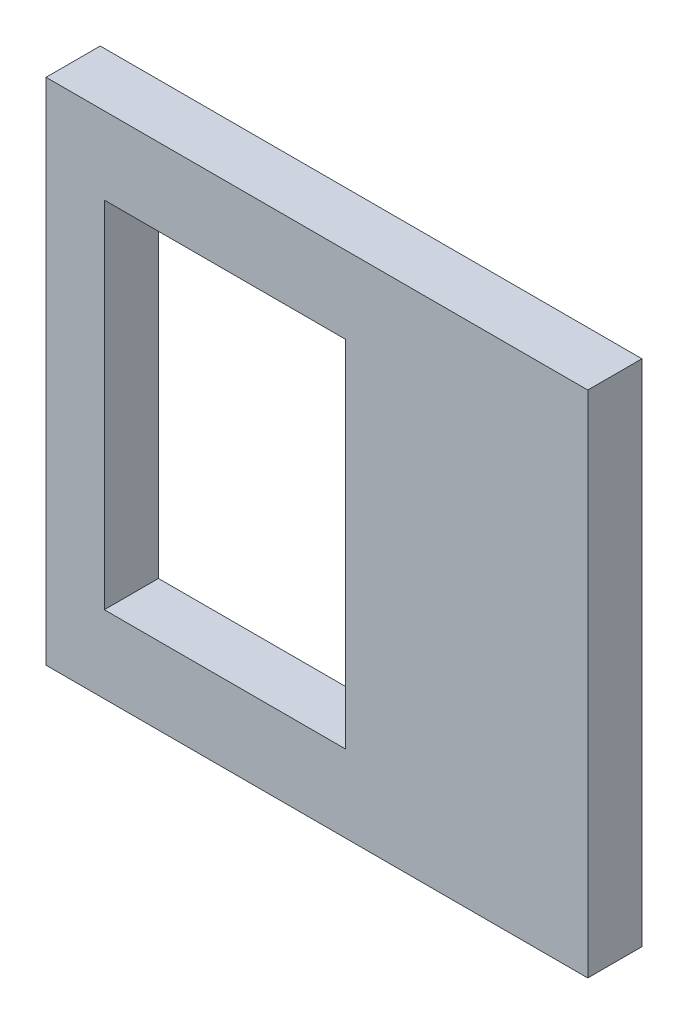
ISO-10303-21;
HEADER;
FILE_DESCRIPTION(('STEP AP214'),'2;1');
FILE_NAME('part.step','',(''),(''),'','','');
FILE_SCHEMA(('AUTOMOTIVE_DESIGN { 1 0 10303 214 1 1 1 1 }'));
ENDSEC;
DATA;
#1=APPLICATION_CONTEXT('core data for automotive mechanical design processes');
#2=APPLICATION_PROTOCOL_DEFINITION('international standard','automotive_design',2000,#1);
#3=PRODUCT_CONTEXT('',#1,'mechanical');
#4=PRODUCT('Part','Part','',(#3));
#5=PRODUCT_RELATED_PRODUCT_CATEGORY('part','',(#4));
#6=PRODUCT_DEFINITION_FORMATION('','',#4);
#7=PRODUCT_DEFINITION_CONTEXT('part definition',#1,'design');
#8=PRODUCT_DEFINITION('design','',#6,#7);
#9=PRODUCT_DEFINITION_SHAPE('','',#8);
#10=(LENGTH_UNIT() NAMED_UNIT(*) SI_UNIT(.MILLI.,.METRE.));
#11=(NAMED_UNIT(*) PLANE_ANGLE_UNIT() SI_UNIT($,.RADIAN.));
#12=(NAMED_UNIT(*) SI_UNIT($,.STERADIAN.) SOLID_ANGLE_UNIT());
#13=UNCERTAINTY_MEASURE_WITH_UNIT(LENGTH_MEASURE(1.E-05),#10,'distance_accuracy_value','');
#14=(GEOMETRIC_REPRESENTATION_CONTEXT(3) GLOBAL_UNCERTAINTY_ASSIGNED_CONTEXT((#13)) GLOBAL_UNIT_ASSIGNED_CONTEXT((#10,
#11,#12)) REPRESENTATION_CONTEXT('',''));
#15=CARTESIAN_POINT('',(0.,0.,0.));
#16=DIRECTION('',(0.,0.,1.));
#17=DIRECTION('',(1.,0.,0.));
#18=AXIS2_PLACEMENT_3D('',#15,#16,#17);
#19=CARTESIAN_POINT('',(50.,-47.,10.));
#20=DIRECTION('',(-1.,0.,0.));
#21=DIRECTION('',(0.,0.,1.));
#22=AXIS2_PLACEMENT_3D('',#19,#20,#21);
#23=PLANE('',#22);
#24=DIRECTION('',(0.,1.,0.));
#25=VECTOR('',#24,1.);
#26=CARTESIAN_POINT('',(50.,-47.,0.));
#27=LINE('',#26,#25);
#28=CARTESIAN_POINT('',(50.,-47.,0.));
#29=VERTEX_POINT('',#28);
#30=CARTESIAN_POINT('',(50.,47.,0.));
#31=VERTEX_POINT('',#30);
#32=EDGE_CURVE('E153',#29,#31,#27,.T.);
#33=ORIENTED_EDGE('',*,*,#32,.T.);
#34=DIRECTION('',(0.,0.,-1.));
#35=VECTOR('',#34,1.);
#36=CARTESIAN_POINT('',(50.,47.,10.));
#37=LINE('',#36,#35);
#38=CARTESIAN_POINT('',(50.,47.,10.));
#39=VERTEX_POINT('',#38);
#40=EDGE_CURVE('E11',#39,#31,#37,.T.);
#41=ORIENTED_EDGE('',*,*,#40,.F.);
#42=DIRECTION('',(0.,1.,0.));
#43=VECTOR('',#42,1.);
#44=CARTESIAN_POINT('',(50.,-47.,10.));
#45=LINE('',#44,#43);
#46=CARTESIAN_POINT('',(50.,-47.,10.));
#47=VERTEX_POINT('',#46);
#48=EDGE_CURVE('E159',#47,#39,#45,.T.);
#49=ORIENTED_EDGE('',*,*,#48,.F.);
#50=DIRECTION('',(0.,0.,-1.));
#51=VECTOR('',#50,1.);
#52=CARTESIAN_POINT('',(50.,-47.,10.));
#53=LINE('',#52,#51);
#54=EDGE_CURVE('E173',#47,#29,#53,.T.);
#55=ORIENTED_EDGE('',*,*,#54,.T.);
#56=EDGE_LOOP('',(#33,#41,#49,#55));
#57=FACE_BOUND('',#56,.T.);
#58=ADVANCED_FACE('F45',(#57),#23,.F.);
#59=CARTESIAN_POINT('',(-50.,47.,10.));
#60=DIRECTION('',(0.,-1.,0.));
#61=DIRECTION('',(0.,0.,-1.));
#62=AXIS2_PLACEMENT_3D('',#59,#60,#61);
#63=PLANE('',#62);
#64=DIRECTION('',(-1.,0.,0.));
#65=VECTOR('',#64,1.);
#66=CARTESIAN_POINT('',(-50.,47.,0.));
#67=LINE('',#66,#65);
#68=CARTESIAN_POINT('',(-50.,47.,0.));
#69=VERTEX_POINT('',#68);
#70=EDGE_CURVE('E177',#31,#69,#67,.T.);
#71=ORIENTED_EDGE('',*,*,#70,.T.);
#72=DIRECTION('',(0.,0.,-1.));
#73=VECTOR('',#72,1.);
#74=CARTESIAN_POINT('',(-50.,47.,10.));
#75=LINE('',#74,#73);
#76=CARTESIAN_POINT('',(-50.,47.,10.));
#77=VERTEX_POINT('',#76);
#78=EDGE_CURVE('E53',#77,#69,#75,.T.);
#79=ORIENTED_EDGE('',*,*,#78,.F.);
#80=DIRECTION('',(-1.,0.,0.));
#81=VECTOR('',#80,1.);
#82=CARTESIAN_POINT('',(-50.,47.,10.));
#83=LINE('',#82,#81);
#84=EDGE_CURVE('E163',#39,#77,#83,.T.);
#85=ORIENTED_EDGE('',*,*,#84,.F.);
#86=ORIENTED_EDGE('',*,*,#40,.T.);
#87=EDGE_LOOP('',(#71,#79,#85,#86));
#88=FACE_BOUND('',#87,.T.);
#89=ADVANCED_FACE('F211',(#88),#63,.F.);
#90=CARTESIAN_POINT('',(-50.,-47.,10.));
#91=DIRECTION('',(1.,0.,0.));
#92=DIRECTION('',(0.,0.,-1.));
#93=AXIS2_PLACEMENT_3D('',#90,#91,#92);
#94=PLANE('',#93);
#95=DIRECTION('',(0.,-1.,0.));
#96=VECTOR('',#95,1.);
#97=CARTESIAN_POINT('',(-50.,-47.,0.));
#98=LINE('',#97,#96);
#99=CARTESIAN_POINT('',(-50.,-47.,0.));
#100=VERTEX_POINT('',#99);
#101=EDGE_CURVE('E180',#69,#100,#98,.T.);
#102=ORIENTED_EDGE('',*,*,#101,.T.);
#103=DIRECTION('',(0.,0.,-1.));
#104=VECTOR('',#103,1.);
#105=CARTESIAN_POINT('',(-50.,-47.,10.));
#106=LINE('',#105,#104);
#107=CARTESIAN_POINT('',(-50.,-47.,10.));
#108=VERTEX_POINT('',#107);
#109=EDGE_CURVE('E188',#108,#100,#106,.T.);
#110=ORIENTED_EDGE('',*,*,#109,.F.);
#111=DIRECTION('',(0.,-1.,0.));
#112=VECTOR('',#111,1.);
#113=CARTESIAN_POINT('',(-50.,-47.,10.));
#114=LINE('',#113,#112);
#115=EDGE_CURVE('E167',#77,#108,#114,.T.);
#116=ORIENTED_EDGE('',*,*,#115,.F.);
#117=ORIENTED_EDGE('',*,*,#78,.T.);
#118=EDGE_LOOP('',(#102,#110,#116,#117));
#119=FACE_BOUND('',#118,.T.);
#120=ADVANCED_FACE('F197',(#119),#94,.F.);
#121=CARTESIAN_POINT('',(-50.,-47.,10.));
#122=DIRECTION('',(0.,1.,0.));
#123=DIRECTION('',(0.,0.,1.));
#124=AXIS2_PLACEMENT_3D('',#121,#122,#123);
#125=PLANE('',#124);
#126=DIRECTION('',(1.,0.,0.));
#127=VECTOR('',#126,1.);
#128=CARTESIAN_POINT('',(-50.,-47.,0.));
#129=LINE('',#128,#127);
#130=EDGE_CURVE('E164',#100,#29,#129,.T.);
#131=ORIENTED_EDGE('',*,*,#130,.T.);
#132=ORIENTED_EDGE('',*,*,#54,.F.);
#133=DIRECTION('',(1.,0.,0.));
#134=VECTOR('',#133,1.);
#135=CARTESIAN_POINT('',(-50.,-47.,10.));
#136=LINE('',#135,#134);
#137=EDGE_CURVE('E170',#108,#47,#136,.T.);
#138=ORIENTED_EDGE('',*,*,#137,.F.);
#139=ORIENTED_EDGE('',*,*,#109,.T.);
#140=EDGE_LOOP('',(#131,#132,#138,#139));
#141=FACE_BOUND('',#140,.T.);
#142=ADVANCED_FACE('F204',(#141),#125,.F.);
#143=CARTESIAN_POINT('',(0.,0.,10.));
#144=DIRECTION('',(0.,0.,-1.));
#145=DIRECTION('',(-1.,0.,0.));
#146=AXIS2_PLACEMENT_3D('',#143,#144,#145);
#147=PLANE('',#146);
#148=DIRECTION('',(1.,0.,0.));
#149=VECTOR('',#148,1.);
#150=CARTESIAN_POINT('',(5.25,-32.75,10.));
#151=LINE('',#150,#149);
#152=CARTESIAN_POINT('',(-39.25,-32.75,10.));
#153=VERTEX_POINT('',#152);
#154=CARTESIAN_POINT('',(5.25,-32.75,10.));
#155=VERTEX_POINT('',#154);
#156=EDGE_CURVE('E144',#153,#155,#151,.T.);
#157=ORIENTED_EDGE('',*,*,#156,.F.);
#158=DIRECTION('',(0.,-1.,0.));
#159=VECTOR('',#158,1.);
#160=CARTESIAN_POINT('',(-39.25,-32.75,10.));
#161=LINE('',#160,#159);
#162=CARTESIAN_POINT('',(-39.25,32.75,10.));
#163=VERTEX_POINT('',#162);
#164=EDGE_CURVE('E60',#163,#153,#161,.T.);
#165=ORIENTED_EDGE('',*,*,#164,.F.);
#166=DIRECTION('',(-1.,0.,0.));
#167=VECTOR('',#166,1.);
#168=CARTESIAN_POINT('',(5.25,32.75,10.));
#169=LINE('',#168,#167);
#170=CARTESIAN_POINT('',(5.25,32.75,10.));
#171=VERTEX_POINT('',#170);
#172=EDGE_CURVE('E131',#171,#163,#169,.T.);
#173=ORIENTED_EDGE('',*,*,#172,.F.);
#174=DIRECTION('',(0.,1.,0.));
#175=VECTOR('',#174,1.);
#176=CARTESIAN_POINT('',(5.25,-32.75,10.));
#177=LINE('',#176,#175);
#178=EDGE_CURVE('E135',#155,#171,#177,.T.);
#179=ORIENTED_EDGE('',*,*,#178,.F.);
#180=EDGE_LOOP('',(#157,#165,#173,#179));
#181=FACE_BOUND('',#180,.T.);
#182=ORIENTED_EDGE('',*,*,#48,.T.);
#183=ORIENTED_EDGE('',*,*,#84,.T.);
#184=ORIENTED_EDGE('',*,*,#115,.T.);
#185=ORIENTED_EDGE('',*,*,#137,.T.);
#186=EDGE_LOOP('',(#182,#183,#184,#185));
#187=FACE_BOUND('',#186,.T.);
#188=ADVANCED_FACE('F210',(#181,#187),#147,.F.);
#189=CARTESIAN_POINT('',(0.,0.,0.));
#190=DIRECTION('',(0.,0.,-1.));
#191=DIRECTION('',(-1.,0.,0.));
#192=AXIS2_PLACEMENT_3D('',#189,#190,#191);
#193=PLANE('',#192);
#194=DIRECTION('',(0.,-1.,0.));
#195=VECTOR('',#194,1.);
#196=CARTESIAN_POINT('',(-39.25,-32.75,0.));
#197=LINE('',#196,#195);
#198=CARTESIAN_POINT('',(-39.25,32.75,0.));
#199=VERTEX_POINT('',#198);
#200=CARTESIAN_POINT('',(-39.25,-32.75,0.));
#201=VERTEX_POINT('',#200);
#202=EDGE_CURVE('E112',#199,#201,#197,.T.);
#203=ORIENTED_EDGE('',*,*,#202,.T.);
#204=DIRECTION('',(1.,0.,0.));
#205=VECTOR('',#204,1.);
#206=CARTESIAN_POINT('',(5.25,-32.75,0.));
#207=LINE('',#206,#205);
#208=CARTESIAN_POINT('',(5.25,-32.75,0.));
#209=VERTEX_POINT('',#208);
#210=EDGE_CURVE('E122',#201,#209,#207,.T.);
#211=ORIENTED_EDGE('',*,*,#210,.T.);
#212=DIRECTION('',(0.,1.,0.));
#213=VECTOR('',#212,1.);
#214=CARTESIAN_POINT('',(5.25,-32.75,0.));
#215=LINE('',#214,#213);
#216=CARTESIAN_POINT('',(5.25,32.75,0.));
#217=VERTEX_POINT('',#216);
#218=EDGE_CURVE('E68',#209,#217,#215,.T.);
#219=ORIENTED_EDGE('',*,*,#218,.T.);
#220=DIRECTION('',(-1.,0.,0.));
#221=VECTOR('',#220,1.);
#222=CARTESIAN_POINT('',(5.25,32.75,0.));
#223=LINE('',#222,#221);
#224=EDGE_CURVE('E119',#217,#199,#223,.T.);
#225=ORIENTED_EDGE('',*,*,#224,.T.);
#226=EDGE_LOOP('',(#203,#211,#219,#225));
#227=FACE_BOUND('',#226,.T.);
#228=ORIENTED_EDGE('',*,*,#32,.F.);
#229=ORIENTED_EDGE('',*,*,#130,.F.);
#230=ORIENTED_EDGE('',*,*,#101,.F.);
#231=ORIENTED_EDGE('',*,*,#70,.F.);
#232=EDGE_LOOP('',(#228,#229,#230,#231));
#233=FACE_BOUND('',#232,.T.);
#234=ADVANCED_FACE('F127',(#227,#233),#193,.T.);
#235=CARTESIAN_POINT('',(-39.25,-32.75,0.));
#236=DIRECTION('',(-1.,0.,0.));
#237=DIRECTION('',(0.,-1.,0.));
#238=AXIS2_PLACEMENT_3D('',#235,#236,#237);
#239=PLANE('',#238);
#240=ORIENTED_EDGE('',*,*,#164,.T.);
#241=DIRECTION('',(0.,0.,1.));
#242=VECTOR('',#241,1.);
#243=CARTESIAN_POINT('',(-39.25,-32.75,0.));
#244=LINE('',#243,#242);
#245=EDGE_CURVE('E108',#201,#153,#244,.T.);
#246=ORIENTED_EDGE('',*,*,#245,.F.);
#247=ORIENTED_EDGE('',*,*,#202,.F.);
#248=DIRECTION('',(0.,0.,1.));
#249=VECTOR('',#248,1.);
#250=CARTESIAN_POINT('',(-39.25,32.75,0.));
#251=LINE('',#250,#249);
#252=EDGE_CURVE('E150',#199,#163,#251,.T.);
#253=ORIENTED_EDGE('',*,*,#252,.T.);
#254=EDGE_LOOP('',(#240,#246,#247,#253));
#255=FACE_BOUND('',#254,.T.);
#256=ADVANCED_FACE('F110',(#255),#239,.F.);
#257=CARTESIAN_POINT('',(5.25,32.75,0.));
#258=DIRECTION('',(0.,1.,0.));
#259=DIRECTION('',(-1.,0.,0.));
#260=AXIS2_PLACEMENT_3D('',#257,#258,#259);
#261=PLANE('',#260);
#262=ORIENTED_EDGE('',*,*,#172,.T.);
#263=ORIENTED_EDGE('',*,*,#252,.F.);
#264=ORIENTED_EDGE('',*,*,#224,.F.);
#265=DIRECTION('',(0.,0.,1.));
#266=VECTOR('',#265,1.);
#267=CARTESIAN_POINT('',(5.25,32.75,0.));
#268=LINE('',#267,#266);
#269=EDGE_CURVE('E154',#217,#171,#268,.T.);
#270=ORIENTED_EDGE('',*,*,#269,.T.);
#271=EDGE_LOOP('',(#262,#263,#264,#270));
#272=FACE_BOUND('',#271,.T.);
#273=ADVANCED_FACE('F228',(#272),#261,.F.);
#274=CARTESIAN_POINT('',(5.25,-32.75,0.));
#275=DIRECTION('',(1.,0.,0.));
#276=DIRECTION('',(0.,0.,-1.));
#277=AXIS2_PLACEMENT_3D('',#274,#275,#276);
#278=PLANE('',#277);
#279=ORIENTED_EDGE('',*,*,#178,.T.);
#280=ORIENTED_EDGE('',*,*,#269,.F.);
#281=ORIENTED_EDGE('',*,*,#218,.F.);
#282=DIRECTION('',(0.,0.,1.));
#283=VECTOR('',#282,1.);
#284=CARTESIAN_POINT('',(5.25,-32.75,0.));
#285=LINE('',#284,#283);
#286=EDGE_CURVE('E118',#209,#155,#285,.T.);
#287=ORIENTED_EDGE('',*,*,#286,.T.);
#288=EDGE_LOOP('',(#279,#280,#281,#287));
#289=FACE_BOUND('',#288,.T.);
#290=ADVANCED_FACE('F231',(#289),#278,.F.);
#291=CARTESIAN_POINT('',(5.25,-32.75,0.));
#292=DIRECTION('',(0.,-1.,0.));
#293=DIRECTION('',(1.,0.,0.));
#294=AXIS2_PLACEMENT_3D('',#291,#292,#293);
#295=PLANE('',#294);
#296=ORIENTED_EDGE('',*,*,#156,.T.);
#297=ORIENTED_EDGE('',*,*,#286,.F.);
#298=ORIENTED_EDGE('',*,*,#210,.F.);
#299=ORIENTED_EDGE('',*,*,#245,.T.);
#300=EDGE_LOOP('',(#296,#297,#298,#299));
#301=FACE_BOUND('',#300,.T.);
#302=ADVANCED_FACE('F123',(#301),#295,.F.);
#303=CLOSED_SHELL('',(#58,#89,#120,#142,#188,#234,#256,#273,#290,#302));
#304=MANIFOLD_SOLID_BREP('B2',#303);
#305=ADVANCED_BREP_SHAPE_REPRESENTATION('',(#18,#304),#14);
#306=SHAPE_DEFINITION_REPRESENTATION(#9,#305);
ENDSEC;
END-ISO-10303-21;
